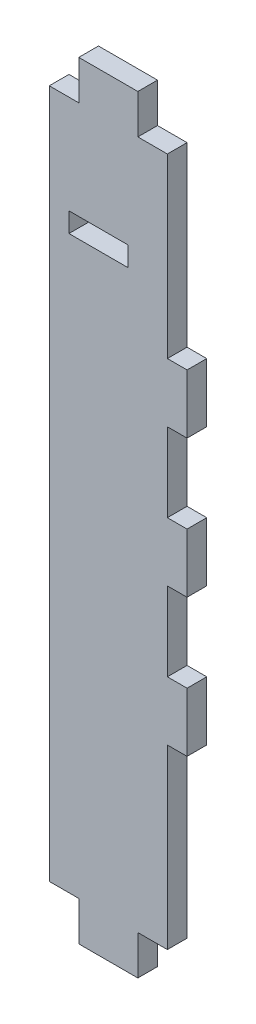
ISO-10303-21;
HEADER;
FILE_DESCRIPTION(('STEP AP214'),'2;1');
FILE_NAME('part.step','',(''),(''),'','','');
FILE_SCHEMA(('AUTOMOTIVE_DESIGN { 1 0 10303 214 1 1 1 1 }'));
ENDSEC;
DATA;
#1=APPLICATION_CONTEXT('core data for automotive mechanical design processes');
#2=APPLICATION_PROTOCOL_DEFINITION('international standard','automotive_design',2000,#1);
#3=PRODUCT_CONTEXT('',#1,'mechanical');
#4=PRODUCT('Part','Part','',(#3));
#5=PRODUCT_RELATED_PRODUCT_CATEGORY('part','',(#4));
#6=PRODUCT_DEFINITION_FORMATION('','',#4);
#7=PRODUCT_DEFINITION_CONTEXT('part definition',#1,'design');
#8=PRODUCT_DEFINITION('design','',#6,#7);
#9=PRODUCT_DEFINITION_SHAPE('','',#8);
#10=(LENGTH_UNIT() NAMED_UNIT(*) SI_UNIT(.MILLI.,.METRE.));
#11=(NAMED_UNIT(*) PLANE_ANGLE_UNIT() SI_UNIT($,.RADIAN.));
#12=(NAMED_UNIT(*) SI_UNIT($,.STERADIAN.) SOLID_ANGLE_UNIT());
#13=UNCERTAINTY_MEASURE_WITH_UNIT(LENGTH_MEASURE(1.E-05),#10,'distance_accuracy_value','');
#14=(GEOMETRIC_REPRESENTATION_CONTEXT(3) GLOBAL_UNCERTAINTY_ASSIGNED_CONTEXT((#13)) GLOBAL_UNIT_ASSIGNED_CONTEXT((#10,
#11,#12)) REPRESENTATION_CONTEXT('',''));
#15=CARTESIAN_POINT('',(0.,0.,0.));
#16=DIRECTION('',(0.,0.,1.));
#17=DIRECTION('',(1.,0.,0.));
#18=AXIS2_PLACEMENT_3D('',#15,#16,#17);
#19=CARTESIAN_POINT('',(405.,0.,-2.5));
#20=DIRECTION('',(-1.,0.,0.));
#21=DIRECTION('',(0.,0.,1.));
#22=AXIS2_PLACEMENT_3D('',#19,#20,#21);
#23=PLANE('',#22);
#24=DIRECTION('',(0.,-1.,0.));
#25=VECTOR('',#24,1.);
#26=CARTESIAN_POINT('',(405.,0.,2.5));
#27=LINE('',#26,#25);
#28=CARTESIAN_POINT('',(405.,405.000000000109,2.5));
#29=VERTEX_POINT('',#28);
#30=CARTESIAN_POINT('',(405.,400.000000000109,2.5));
#31=VERTEX_POINT('',#30);
#32=EDGE_CURVE('E316',#29,#31,#27,.T.);
#33=ORIENTED_EDGE('',*,*,#32,.T.);
#34=DIRECTION('',(0.,0.,1.));
#35=VECTOR('',#34,1.);
#36=CARTESIAN_POINT('',(405.,400.000000000109,-2.5));
#37=LINE('',#36,#35);
#38=CARTESIAN_POINT('',(405.,400.000000000109,-2.5));
#39=VERTEX_POINT('',#38);
#40=EDGE_CURVE('E11',#39,#31,#37,.T.);
#41=ORIENTED_EDGE('',*,*,#40,.F.);
#42=DIRECTION('',(0.,-1.,0.));
#43=VECTOR('',#42,1.);
#44=CARTESIAN_POINT('',(405.,0.,-2.5));
#45=LINE('',#44,#43);
#46=CARTESIAN_POINT('',(405.,405.000000000109,-2.5));
#47=VERTEX_POINT('',#46);
#48=EDGE_CURVE('E58',#47,#39,#45,.T.);
#49=ORIENTED_EDGE('',*,*,#48,.F.);
#50=DIRECTION('',(0.,0.,1.));
#51=VECTOR('',#50,1.);
#52=CARTESIAN_POINT('',(405.,405.000000000109,-2.5));
#53=LINE('',#52,#51);
#54=EDGE_CURVE('E239',#47,#29,#53,.T.);
#55=ORIENTED_EDGE('',*,*,#54,.T.);
#56=EDGE_LOOP('',(#33,#41,#49,#55));
#57=FACE_BOUND('',#56,.T.);
#58=ADVANCED_FACE('F39',(#57),#23,.F.);
#59=CARTESIAN_POINT('',(0.,400.000000000109,-2.5));
#60=DIRECTION('',(0.,1.,0.));
#61=DIRECTION('',(0.,0.,1.));
#62=AXIS2_PLACEMENT_3D('',#59,#60,#61);
#63=PLANE('',#62);
#64=DIRECTION('',(-1.,0.,0.));
#65=VECTOR('',#64,1.);
#66=CARTESIAN_POINT('',(0.,400.000000000109,2.5));
#67=LINE('',#66,#65);
#68=CARTESIAN_POINT('',(420.,400.000000000109,2.5));
#69=VERTEX_POINT('',#68);
#70=EDGE_CURVE('E321',#69,#31,#67,.T.);
#71=ORIENTED_EDGE('',*,*,#70,.F.);
#72=DIRECTION('',(0.,0.,1.));
#73=VECTOR('',#72,1.);
#74=CARTESIAN_POINT('',(420.,400.000000000109,-2.5));
#75=LINE('',#74,#73);
#76=CARTESIAN_POINT('',(420.,400.000000000109,-2.5));
#77=VERTEX_POINT('',#76);
#78=EDGE_CURVE('E49',#77,#69,#75,.T.);
#79=ORIENTED_EDGE('',*,*,#78,.F.);
#80=DIRECTION('',(-1.,0.,0.));
#81=VECTOR('',#80,1.);
#82=CARTESIAN_POINT('',(0.,400.000000000109,-2.5));
#83=LINE('',#82,#81);
#84=EDGE_CURVE('E247',#77,#39,#83,.T.);
#85=ORIENTED_EDGE('',*,*,#84,.T.);
#86=ORIENTED_EDGE('',*,*,#40,.T.);
#87=EDGE_LOOP('',(#71,#79,#85,#86));
#88=FACE_BOUND('',#87,.T.);
#89=ADVANCED_FACE('F403',(#88),#63,.T.);
#90=CARTESIAN_POINT('',(419.999999999996,-4.66293670342561E-12,-2.5));
#91=DIRECTION('',(-1.,0.,0.));
#92=DIRECTION('',(0.,-1.,0.));
#93=AXIS2_PLACEMENT_3D('',#90,#91,#92);
#94=PLANE('',#93);
#95=DIRECTION('',(0.,-1.,0.));
#96=VECTOR('',#95,1.);
#97=CARTESIAN_POINT('',(419.999999999996,-4.66293670342561E-12,2.5));
#98=LINE('',#97,#96);
#99=CARTESIAN_POINT('',(420.,405.000000000109,2.5));
#100=VERTEX_POINT('',#99);
#101=EDGE_CURVE('E236',#100,#69,#98,.T.);
#102=ORIENTED_EDGE('',*,*,#101,.F.);
#103=DIRECTION('',(0.,0.,1.));
#104=VECTOR('',#103,1.);
#105=CARTESIAN_POINT('',(420.,405.000000000109,-2.5));
#106=LINE('',#105,#104);
#107=CARTESIAN_POINT('',(420.,405.000000000109,-2.5));
#108=VERTEX_POINT('',#107);
#109=EDGE_CURVE('E231',#108,#100,#106,.T.);
#110=ORIENTED_EDGE('',*,*,#109,.F.);
#111=DIRECTION('',(0.,-1.,0.));
#112=VECTOR('',#111,1.);
#113=CARTESIAN_POINT('',(419.999999999996,-4.66293670342561E-12,-2.5));
#114=LINE('',#113,#112);
#115=EDGE_CURVE('E235',#108,#77,#114,.T.);
#116=ORIENTED_EDGE('',*,*,#115,.T.);
#117=ORIENTED_EDGE('',*,*,#78,.T.);
#118=EDGE_LOOP('',(#102,#110,#116,#117));
#119=FACE_BOUND('',#118,.T.);
#120=ADVANCED_FACE('F233',(#119),#94,.T.);
#121=CARTESIAN_POINT('',(430.,0.,-2.5));
#122=DIRECTION('',(-1.,0.,0.));
#123=DIRECTION('',(0.,0.,1.));
#124=AXIS2_PLACEMENT_3D('',#121,#122,#123);
#125=PLANE('',#124);
#126=DIRECTION('',(0.,-1.,0.));
#127=VECTOR('',#126,1.);
#128=CARTESIAN_POINT('',(430.,0.,2.5));
#129=LINE('',#128,#127);
#130=CARTESIAN_POINT('',(430.,300.00000000011,2.5));
#131=VERTEX_POINT('',#130);
#132=CARTESIAN_POINT('',(430.,255.000000000111,2.5));
#133=VERTEX_POINT('',#132);
#134=EDGE_CURVE('E252',#131,#133,#129,.T.);
#135=ORIENTED_EDGE('',*,*,#134,.T.);
#136=DIRECTION('',(0.,0.,1.));
#137=VECTOR('',#136,1.);
#138=CARTESIAN_POINT('',(430.,255.000000000111,-2.5));
#139=LINE('',#138,#137);
#140=CARTESIAN_POINT('',(430.,255.000000000111,-2.5));
#141=VERTEX_POINT('',#140);
#142=EDGE_CURVE('E327',#141,#133,#139,.T.);
#143=ORIENTED_EDGE('',*,*,#142,.F.);
#144=DIRECTION('',(0.,-1.,0.));
#145=VECTOR('',#144,1.);
#146=CARTESIAN_POINT('',(430.,0.,-2.5));
#147=LINE('',#146,#145);
#148=CARTESIAN_POINT('',(430.,300.00000000011,-2.5));
#149=VERTEX_POINT('',#148);
#150=EDGE_CURVE('E323',#149,#141,#147,.T.);
#151=ORIENTED_EDGE('',*,*,#150,.F.);
#152=DIRECTION('',(0.,0.,1.));
#153=VECTOR('',#152,1.);
#154=CARTESIAN_POINT('',(430.,300.00000000011,-2.5));
#155=LINE('',#154,#153);
#156=EDGE_CURVE('E43',#149,#131,#155,.T.);
#157=ORIENTED_EDGE('',*,*,#156,.T.);
#158=EDGE_LOOP('',(#135,#143,#151,#157));
#159=FACE_BOUND('',#158,.T.);
#160=ADVANCED_FACE('F41',(#159),#125,.F.);
#161=CARTESIAN_POINT('',(0.,255.000000000111,-2.5));
#162=DIRECTION('',(0.,1.,0.));
#163=DIRECTION('',(0.,0.,1.));
#164=AXIS2_PLACEMENT_3D('',#161,#162,#163);
#165=PLANE('',#164);
#166=DIRECTION('',(-1.,0.,0.));
#167=VECTOR('',#166,1.);
#168=CARTESIAN_POINT('',(0.,255.000000000111,2.5));
#169=LINE('',#168,#167);
#170=CARTESIAN_POINT('',(422.5,255.000000000111,2.5));
#171=VERTEX_POINT('',#170);
#172=EDGE_CURVE('E314',#133,#171,#169,.T.);
#173=ORIENTED_EDGE('',*,*,#172,.T.);
#174=DIRECTION('',(0.,0.,1.));
#175=VECTOR('',#174,1.);
#176=CARTESIAN_POINT('',(422.5,255.000000000111,-2.5));
#177=LINE('',#176,#175);
#178=CARTESIAN_POINT('',(422.5,255.000000000111,-2.5));
#179=VERTEX_POINT('',#178);
#180=EDGE_CURVE('E330',#179,#171,#177,.T.);
#181=ORIENTED_EDGE('',*,*,#180,.F.);
#182=DIRECTION('',(-1.,0.,0.));
#183=VECTOR('',#182,1.);
#184=CARTESIAN_POINT('',(0.,255.000000000111,-2.5));
#185=LINE('',#184,#183);
#186=EDGE_CURVE('E557',#141,#179,#185,.T.);
#187=ORIENTED_EDGE('',*,*,#186,.F.);
#188=ORIENTED_EDGE('',*,*,#142,.T.);
#189=EDGE_LOOP('',(#173,#181,#187,#188));
#190=FACE_BOUND('',#189,.T.);
#191=ADVANCED_FACE('F412',(#190),#165,.F.);
#192=CARTESIAN_POINT('',(422.5,0.,-2.5));
#193=DIRECTION('',(-1.,0.,0.));
#194=DIRECTION('',(0.,0.,1.));
#195=AXIS2_PLACEMENT_3D('',#192,#193,#194);
#196=PLANE('',#195);
#197=DIRECTION('',(0.,-1.,0.));
#198=VECTOR('',#197,1.);
#199=CARTESIAN_POINT('',(422.5,0.,2.5));
#200=LINE('',#199,#198);
#201=CARTESIAN_POINT('',(422.5,245.000000000111,2.5));
#202=VERTEX_POINT('',#201);
#203=EDGE_CURVE('E312',#171,#202,#200,.T.);
#204=ORIENTED_EDGE('',*,*,#203,.T.);
#205=DIRECTION('',(0.,0.,1.));
#206=VECTOR('',#205,1.);
#207=CARTESIAN_POINT('',(422.5,245.000000000111,-2.5));
#208=LINE('',#207,#206);
#209=CARTESIAN_POINT('',(422.5,245.000000000111,-2.5));
#210=VERTEX_POINT('',#209);
#211=EDGE_CURVE('E333',#210,#202,#208,.T.);
#212=ORIENTED_EDGE('',*,*,#211,.F.);
#213=DIRECTION('',(0.,-1.,0.));
#214=VECTOR('',#213,1.);
#215=CARTESIAN_POINT('',(422.5,0.,-2.5));
#216=LINE('',#215,#214);
#217=EDGE_CURVE('E555',#179,#210,#216,.T.);
#218=ORIENTED_EDGE('',*,*,#217,.F.);
#219=ORIENTED_EDGE('',*,*,#180,.T.);
#220=EDGE_LOOP('',(#204,#212,#218,#219));
#221=FACE_BOUND('',#220,.T.);
#222=ADVANCED_FACE('F415',(#221),#196,.F.);
#223=CARTESIAN_POINT('',(0.,245.000000000111,-2.5));
#224=DIRECTION('',(0.,1.,0.));
#225=DIRECTION('',(0.,0.,1.));
#226=AXIS2_PLACEMENT_3D('',#223,#224,#225);
#227=PLANE('',#226);
#228=DIRECTION('',(-1.,0.,0.));
#229=VECTOR('',#228,1.);
#230=CARTESIAN_POINT('',(0.,245.000000000111,2.5));
#231=LINE('',#230,#229);
#232=CARTESIAN_POINT('',(407.5,245.000000000111,2.5));
#233=VERTEX_POINT('',#232);
#234=EDGE_CURVE('E309',#202,#233,#231,.T.);
#235=ORIENTED_EDGE('',*,*,#234,.T.);
#236=DIRECTION('',(0.,0.,1.));
#237=VECTOR('',#236,1.);
#238=CARTESIAN_POINT('',(407.5,245.000000000111,-2.5));
#239=LINE('',#238,#237);
#240=CARTESIAN_POINT('',(407.5,245.000000000111,-2.5));
#241=VERTEX_POINT('',#240);
#242=EDGE_CURVE('E336',#241,#233,#239,.T.);
#243=ORIENTED_EDGE('',*,*,#242,.F.);
#244=DIRECTION('',(-1.,0.,0.));
#245=VECTOR('',#244,1.);
#246=CARTESIAN_POINT('',(0.,245.000000000111,-2.5));
#247=LINE('',#246,#245);
#248=EDGE_CURVE('E553',#210,#241,#247,.T.);
#249=ORIENTED_EDGE('',*,*,#248,.F.);
#250=ORIENTED_EDGE('',*,*,#211,.T.);
#251=EDGE_LOOP('',(#235,#243,#249,#250));
#252=FACE_BOUND('',#251,.T.);
#253=ADVANCED_FACE('F419',(#252),#227,.F.);
#254=CARTESIAN_POINT('',(407.5,0.,-2.5));
#255=DIRECTION('',(-1.,0.,0.));
#256=DIRECTION('',(0.,0.,1.));
#257=AXIS2_PLACEMENT_3D('',#254,#255,#256);
#258=PLANE('',#257);
#259=DIRECTION('',(0.,-1.,0.));
#260=VECTOR('',#259,1.);
#261=CARTESIAN_POINT('',(407.5,0.,2.5));
#262=LINE('',#261,#260);
#263=CARTESIAN_POINT('',(407.5,255.000000000111,2.5));
#264=VERTEX_POINT('',#263);
#265=EDGE_CURVE('E306',#264,#233,#262,.T.);
#266=ORIENTED_EDGE('',*,*,#265,.F.);
#267=DIRECTION('',(0.,0.,1.));
#268=VECTOR('',#267,1.);
#269=CARTESIAN_POINT('',(407.5,255.000000000111,-2.5));
#270=LINE('',#269,#268);
#271=CARTESIAN_POINT('',(407.5,255.000000000111,-2.5));
#272=VERTEX_POINT('',#271);
#273=EDGE_CURVE('E338',#272,#264,#270,.T.);
#274=ORIENTED_EDGE('',*,*,#273,.F.);
#275=DIRECTION('',(0.,-1.,0.));
#276=VECTOR('',#275,1.);
#277=CARTESIAN_POINT('',(407.5,0.,-2.5));
#278=LINE('',#277,#276);
#279=EDGE_CURVE('E550',#272,#241,#278,.T.);
#280=ORIENTED_EDGE('',*,*,#279,.T.);
#281=ORIENTED_EDGE('',*,*,#242,.T.);
#282=EDGE_LOOP('',(#266,#274,#280,#281));
#283=FACE_BOUND('',#282,.T.);
#284=ADVANCED_FACE('F423',(#283),#258,.T.);
#285=CARTESIAN_POINT('',(0.,255.000000000111,-2.5));
#286=DIRECTION('',(0.,1.,0.));
#287=DIRECTION('',(0.,0.,1.));
#288=AXIS2_PLACEMENT_3D('',#285,#286,#287);
#289=PLANE('',#288);
#290=DIRECTION('',(-1.,0.,0.));
#291=VECTOR('',#290,1.);
#292=CARTESIAN_POINT('',(0.,255.000000000111,2.5));
#293=LINE('',#292,#291);
#294=CARTESIAN_POINT('',(400.,255.000000000111,2.5));
#295=VERTEX_POINT('',#294);
#296=EDGE_CURVE('E303',#264,#295,#293,.T.);
#297=ORIENTED_EDGE('',*,*,#296,.T.);
#298=DIRECTION('',(0.,0.,1.));
#299=VECTOR('',#298,1.);
#300=CARTESIAN_POINT('',(400.,255.000000000111,-2.5));
#301=LINE('',#300,#299);
#302=CARTESIAN_POINT('',(400.,255.000000000111,-2.5));
#303=VERTEX_POINT('',#302);
#304=EDGE_CURVE('E340',#303,#295,#301,.T.);
#305=ORIENTED_EDGE('',*,*,#304,.F.);
#306=DIRECTION('',(-1.,0.,0.));
#307=VECTOR('',#306,1.);
#308=CARTESIAN_POINT('',(0.,255.000000000111,-2.5));
#309=LINE('',#308,#307);
#310=EDGE_CURVE('E548',#272,#303,#309,.T.);
#311=ORIENTED_EDGE('',*,*,#310,.F.);
#312=ORIENTED_EDGE('',*,*,#273,.T.);
#313=EDGE_LOOP('',(#297,#305,#311,#312));
#314=FACE_BOUND('',#313,.T.);
#315=ADVANCED_FACE('F427',(#314),#289,.F.);
#316=CARTESIAN_POINT('',(400.,0.,-2.5));
#317=DIRECTION('',(-1.,0.,0.));
#318=DIRECTION('',(0.,0.,1.));
#319=AXIS2_PLACEMENT_3D('',#316,#317,#318);
#320=PLANE('',#319);
#321=DIRECTION('',(0.,-1.,0.));
#322=VECTOR('',#321,1.);
#323=CARTESIAN_POINT('',(400.,0.,2.5));
#324=LINE('',#323,#322);
#325=CARTESIAN_POINT('',(400.,430.000000000109,2.5));
#326=VERTEX_POINT('',#325);
#327=EDGE_CURVE('E300',#326,#295,#324,.T.);
#328=ORIENTED_EDGE('',*,*,#327,.F.);
#329=DIRECTION('',(0.,0.,1.));
#330=VECTOR('',#329,1.);
#331=CARTESIAN_POINT('',(400.,430.000000000109,-2.5));
#332=LINE('',#331,#330);
#333=CARTESIAN_POINT('',(400.,430.000000000109,-2.5));
#334=VERTEX_POINT('',#333);
#335=EDGE_CURVE('E342',#334,#326,#332,.T.);
#336=ORIENTED_EDGE('',*,*,#335,.F.);
#337=DIRECTION('',(0.,-1.,0.));
#338=VECTOR('',#337,1.);
#339=CARTESIAN_POINT('',(400.,0.,-2.5));
#340=LINE('',#339,#338);
#341=EDGE_CURVE('E545',#334,#303,#340,.T.);
#342=ORIENTED_EDGE('',*,*,#341,.T.);
#343=ORIENTED_EDGE('',*,*,#304,.T.);
#344=EDGE_LOOP('',(#328,#336,#342,#343));
#345=FACE_BOUND('',#344,.T.);
#346=ADVANCED_FACE('F431',(#345),#320,.T.);
#347=CARTESIAN_POINT('',(0.,430.000000000109,-2.5));
#348=DIRECTION('',(0.,1.,0.));
#349=DIRECTION('',(0.,0.,1.));
#350=AXIS2_PLACEMENT_3D('',#347,#348,#349);
#351=PLANE('',#350);
#352=DIRECTION('',(-1.,0.,0.));
#353=VECTOR('',#352,1.);
#354=CARTESIAN_POINT('',(0.,430.000000000109,2.5));
#355=LINE('',#354,#353);
#356=CARTESIAN_POINT('',(407.5,430.000000000109,2.5));
#357=VERTEX_POINT('',#356);
#358=EDGE_CURVE('E297',#357,#326,#355,.T.);
#359=ORIENTED_EDGE('',*,*,#358,.F.);
#360=DIRECTION('',(0.,0.,1.));
#361=VECTOR('',#360,1.);
#362=CARTESIAN_POINT('',(407.5,430.000000000109,-2.5));
#363=LINE('',#362,#361);
#364=CARTESIAN_POINT('',(407.5,430.000000000109,-2.5));
#365=VERTEX_POINT('',#364);
#366=EDGE_CURVE('E344',#365,#357,#363,.T.);
#367=ORIENTED_EDGE('',*,*,#366,.F.);
#368=DIRECTION('',(-1.,0.,0.));
#369=VECTOR('',#368,1.);
#370=CARTESIAN_POINT('',(0.,430.000000000109,-2.5));
#371=LINE('',#370,#369);
#372=EDGE_CURVE('E542',#365,#334,#371,.T.);
#373=ORIENTED_EDGE('',*,*,#372,.T.);
#374=ORIENTED_EDGE('',*,*,#335,.T.);
#375=EDGE_LOOP('',(#359,#367,#373,#374));
#376=FACE_BOUND('',#375,.T.);
#377=ADVANCED_FACE('F435',(#376),#351,.T.);
#378=CARTESIAN_POINT('',(407.5,0.,-2.5));
#379=DIRECTION('',(1.,0.,0.));
#380=DIRECTION('',(0.,0.,-1.));
#381=AXIS2_PLACEMENT_3D('',#378,#379,#380);
#382=PLANE('',#381);
#383=DIRECTION('',(0.,1.,0.));
#384=VECTOR('',#383,1.);
#385=CARTESIAN_POINT('',(407.5,0.,2.5));
#386=LINE('',#385,#384);
#387=CARTESIAN_POINT('',(407.5,440.000000000109,2.5));
#388=VERTEX_POINT('',#387);
#389=EDGE_CURVE('E294',#357,#388,#386,.T.);
#390=ORIENTED_EDGE('',*,*,#389,.T.);
#391=DIRECTION('',(0.,0.,1.));
#392=VECTOR('',#391,1.);
#393=CARTESIAN_POINT('',(407.5,440.000000000109,-2.5));
#394=LINE('',#393,#392);
#395=CARTESIAN_POINT('',(407.5,440.000000000109,-2.5));
#396=VERTEX_POINT('',#395);
#397=EDGE_CURVE('E346',#396,#388,#394,.T.);
#398=ORIENTED_EDGE('',*,*,#397,.F.);
#399=DIRECTION('',(0.,1.,0.));
#400=VECTOR('',#399,1.);
#401=CARTESIAN_POINT('',(407.5,0.,-2.5));
#402=LINE('',#401,#400);
#403=EDGE_CURVE('E540',#365,#396,#402,.T.);
#404=ORIENTED_EDGE('',*,*,#403,.F.);
#405=ORIENTED_EDGE('',*,*,#366,.T.);
#406=EDGE_LOOP('',(#390,#398,#404,#405));
#407=FACE_BOUND('',#406,.T.);
#408=ADVANCED_FACE('F439',(#407),#382,.F.);
#409=CARTESIAN_POINT('',(0.,440.000000000109,-2.5));
#410=DIRECTION('',(0.,1.,0.));
#411=DIRECTION('',(0.,0.,1.));
#412=AXIS2_PLACEMENT_3D('',#409,#410,#411);
#413=PLANE('',#412);
#414=DIRECTION('',(-1.,0.,0.));
#415=VECTOR('',#414,1.);
#416=CARTESIAN_POINT('',(0.,440.000000000109,2.5));
#417=LINE('',#416,#415);
#418=CARTESIAN_POINT('',(422.5,440.000000000109,2.5));
#419=VERTEX_POINT('',#418);
#420=EDGE_CURVE('E291',#419,#388,#417,.T.);
#421=ORIENTED_EDGE('',*,*,#420,.F.);
#422=DIRECTION('',(0.,0.,1.));
#423=VECTOR('',#422,1.);
#424=CARTESIAN_POINT('',(422.5,440.000000000109,-2.5));
#425=LINE('',#424,#423);
#426=CARTESIAN_POINT('',(422.5,440.000000000109,-2.5));
#427=VERTEX_POINT('',#426);
#428=EDGE_CURVE('E348',#427,#419,#425,.T.);
#429=ORIENTED_EDGE('',*,*,#428,.F.);
#430=DIRECTION('',(-1.,0.,0.));
#431=VECTOR('',#430,1.);
#432=CARTESIAN_POINT('',(0.,440.000000000109,-2.5));
#433=LINE('',#432,#431);
#434=EDGE_CURVE('E537',#427,#396,#433,.T.);
#435=ORIENTED_EDGE('',*,*,#434,.T.);
#436=ORIENTED_EDGE('',*,*,#397,.T.);
#437=EDGE_LOOP('',(#421,#429,#435,#436));
#438=FACE_BOUND('',#437,.T.);
#439=ADVANCED_FACE('F443',(#438),#413,.T.);
#440=CARTESIAN_POINT('',(422.5,0.,-2.5));
#441=DIRECTION('',(1.,0.,0.));
#442=DIRECTION('',(0.,0.,-1.));
#443=AXIS2_PLACEMENT_3D('',#440,#441,#442);
#444=PLANE('',#443);
#445=DIRECTION('',(0.,1.,0.));
#446=VECTOR('',#445,1.);
#447=CARTESIAN_POINT('',(422.5,0.,2.5));
#448=LINE('',#447,#446);
#449=CARTESIAN_POINT('',(422.5,430.000000000109,2.5));
#450=VERTEX_POINT('',#449);
#451=EDGE_CURVE('E288',#450,#419,#448,.T.);
#452=ORIENTED_EDGE('',*,*,#451,.F.);
#453=DIRECTION('',(0.,0.,1.));
#454=VECTOR('',#453,1.);
#455=CARTESIAN_POINT('',(422.5,430.000000000109,-2.5));
#456=LINE('',#455,#454);
#457=CARTESIAN_POINT('',(422.5,430.000000000109,-2.5));
#458=VERTEX_POINT('',#457);
#459=EDGE_CURVE('E350',#458,#450,#456,.T.);
#460=ORIENTED_EDGE('',*,*,#459,.F.);
#461=DIRECTION('',(0.,1.,0.));
#462=VECTOR('',#461,1.);
#463=CARTESIAN_POINT('',(422.5,0.,-2.5));
#464=LINE('',#463,#462);
#465=EDGE_CURVE('E534',#458,#427,#464,.T.);
#466=ORIENTED_EDGE('',*,*,#465,.T.);
#467=ORIENTED_EDGE('',*,*,#428,.T.);
#468=EDGE_LOOP('',(#452,#460,#466,#467));
#469=FACE_BOUND('',#468,.T.);
#470=ADVANCED_FACE('F447',(#469),#444,.T.);
#471=CARTESIAN_POINT('',(0.,430.000000000109,-2.5));
#472=DIRECTION('',(0.,1.,0.));
#473=DIRECTION('',(0.,0.,1.));
#474=AXIS2_PLACEMENT_3D('',#471,#472,#473);
#475=PLANE('',#474);
#476=DIRECTION('',(-1.,0.,0.));
#477=VECTOR('',#476,1.);
#478=CARTESIAN_POINT('',(0.,430.000000000109,2.5));
#479=LINE('',#478,#477);
#480=CARTESIAN_POINT('',(430.,430.000000000109,2.5));
#481=VERTEX_POINT('',#480);
#482=EDGE_CURVE('E285',#481,#450,#479,.T.);
#483=ORIENTED_EDGE('',*,*,#482,.F.);
#484=DIRECTION('',(0.,0.,1.));
#485=VECTOR('',#484,1.);
#486=CARTESIAN_POINT('',(430.,430.000000000109,-2.5));
#487=LINE('',#486,#485);
#488=CARTESIAN_POINT('',(430.,430.000000000109,-2.5));
#489=VERTEX_POINT('',#488);
#490=EDGE_CURVE('E352',#489,#481,#487,.T.);
#491=ORIENTED_EDGE('',*,*,#490,.F.);
#492=DIRECTION('',(-1.,0.,0.));
#493=VECTOR('',#492,1.);
#494=CARTESIAN_POINT('',(0.,430.000000000109,-2.5));
#495=LINE('',#494,#493);
#496=EDGE_CURVE('E531',#489,#458,#495,.T.);
#497=ORIENTED_EDGE('',*,*,#496,.T.);
#498=ORIENTED_EDGE('',*,*,#459,.T.);
#499=EDGE_LOOP('',(#483,#491,#497,#498));
#500=FACE_BOUND('',#499,.T.);
#501=ADVANCED_FACE('F451',(#500),#475,.T.);
#502=CARTESIAN_POINT('',(430.,0.,-2.5));
#503=DIRECTION('',(-1.,0.,0.));
#504=DIRECTION('',(0.,0.,1.));
#505=AXIS2_PLACEMENT_3D('',#502,#503,#504);
#506=PLANE('',#505);
#507=DIRECTION('',(0.,-1.,0.));
#508=VECTOR('',#507,1.);
#509=CARTESIAN_POINT('',(430.,0.,2.5));
#510=LINE('',#509,#508);
#511=CARTESIAN_POINT('',(430.,385.00000000011,2.5));
#512=VERTEX_POINT('',#511);
#513=EDGE_CURVE('E283',#481,#512,#510,.T.);
#514=ORIENTED_EDGE('',*,*,#513,.T.);
#515=DIRECTION('',(0.,0.,1.));
#516=VECTOR('',#515,1.);
#517=CARTESIAN_POINT('',(430.,385.00000000011,-2.5));
#518=LINE('',#517,#516);
#519=CARTESIAN_POINT('',(430.,385.00000000011,-2.5));
#520=VERTEX_POINT('',#519);
#521=EDGE_CURVE('E354',#520,#512,#518,.T.);
#522=ORIENTED_EDGE('',*,*,#521,.F.);
#523=DIRECTION('',(0.,-1.,0.));
#524=VECTOR('',#523,1.);
#525=CARTESIAN_POINT('',(430.,0.,-2.5));
#526=LINE('',#525,#524);
#527=EDGE_CURVE('E529',#489,#520,#526,.T.);
#528=ORIENTED_EDGE('',*,*,#527,.F.);
#529=ORIENTED_EDGE('',*,*,#490,.T.);
#530=EDGE_LOOP('',(#514,#522,#528,#529));
#531=FACE_BOUND('',#530,.T.);
#532=ADVANCED_FACE('F455',(#531),#506,.F.);
#533=CARTESIAN_POINT('',(0.,385.00000000011,-2.5));
#534=DIRECTION('',(0.,-1.,0.));
#535=DIRECTION('',(0.,0.,-1.));
#536=AXIS2_PLACEMENT_3D('',#533,#534,#535);
#537=PLANE('',#536);
#538=DIRECTION('',(1.,0.,0.));
#539=VECTOR('',#538,1.);
#540=CARTESIAN_POINT('',(0.,385.00000000011,2.5));
#541=LINE('',#540,#539);
#542=CARTESIAN_POINT('',(435.,385.00000000011,2.5));
#543=VERTEX_POINT('',#542);
#544=EDGE_CURVE('E281',#512,#543,#541,.T.);
#545=ORIENTED_EDGE('',*,*,#544,.T.);
#546=DIRECTION('',(0.,0.,1.));
#547=VECTOR('',#546,1.);
#548=CARTESIAN_POINT('',(435.,385.00000000011,-2.5));
#549=LINE('',#548,#547);
#550=CARTESIAN_POINT('',(435.,385.00000000011,-2.5));
#551=VERTEX_POINT('',#550);
#552=EDGE_CURVE('E357',#551,#543,#549,.T.);
#553=ORIENTED_EDGE('',*,*,#552,.F.);
#554=DIRECTION('',(1.,0.,0.));
#555=VECTOR('',#554,1.);
#556=CARTESIAN_POINT('',(0.,385.00000000011,-2.5));
#557=LINE('',#556,#555);
#558=EDGE_CURVE('E527',#520,#551,#557,.T.);
#559=ORIENTED_EDGE('',*,*,#558,.F.);
#560=ORIENTED_EDGE('',*,*,#521,.T.);
#561=EDGE_LOOP('',(#545,#553,#559,#560));
#562=FACE_BOUND('',#561,.T.);
#563=ADVANCED_FACE('F459',(#562),#537,.F.);
#564=CARTESIAN_POINT('',(435.,0.,-2.5));
#565=DIRECTION('',(-1.,0.,0.));
#566=DIRECTION('',(0.,0.,1.));
#567=AXIS2_PLACEMENT_3D('',#564,#565,#566);
#568=PLANE('',#567);
#569=DIRECTION('',(0.,-1.,0.));
#570=VECTOR('',#569,1.);
#571=CARTESIAN_POINT('',(435.,0.,2.5));
#572=LINE('',#571,#570);
#573=CARTESIAN_POINT('',(435.,370.00000000011,2.5));
#574=VERTEX_POINT('',#573);
#575=EDGE_CURVE('E278',#543,#574,#572,.T.);
#576=ORIENTED_EDGE('',*,*,#575,.T.);
#577=DIRECTION('',(0.,0.,1.));
#578=VECTOR('',#577,1.);
#579=CARTESIAN_POINT('',(435.,370.00000000011,-2.5));
#580=LINE('',#579,#578);
#581=CARTESIAN_POINT('',(435.,370.00000000011,-2.5));
#582=VERTEX_POINT('',#581);
#583=EDGE_CURVE('E360',#582,#574,#580,.T.);
#584=ORIENTED_EDGE('',*,*,#583,.F.);
#585=DIRECTION('',(0.,-1.,0.));
#586=VECTOR('',#585,1.);
#587=CARTESIAN_POINT('',(435.,0.,-2.5));
#588=LINE('',#587,#586);
#589=EDGE_CURVE('E525',#551,#582,#588,.T.);
#590=ORIENTED_EDGE('',*,*,#589,.F.);
#591=ORIENTED_EDGE('',*,*,#552,.T.);
#592=EDGE_LOOP('',(#576,#584,#590,#591));
#593=FACE_BOUND('',#592,.T.);
#594=ADVANCED_FACE('F463',(#593),#568,.F.);
#595=CARTESIAN_POINT('',(0.,370.00000000011,-2.5));
#596=DIRECTION('',(0.,-1.,0.));
#597=DIRECTION('',(0.,0.,-1.));
#598=AXIS2_PLACEMENT_3D('',#595,#596,#597);
#599=PLANE('',#598);
#600=DIRECTION('',(1.,0.,0.));
#601=VECTOR('',#600,1.);
#602=CARTESIAN_POINT('',(0.,370.00000000011,2.5));
#603=LINE('',#602,#601);
#604=CARTESIAN_POINT('',(430.,370.00000000011,2.5));
#605=VERTEX_POINT('',#604);
#606=EDGE_CURVE('E275',#605,#574,#603,.T.);
#607=ORIENTED_EDGE('',*,*,#606,.F.);
#608=DIRECTION('',(0.,0.,1.));
#609=VECTOR('',#608,1.);
#610=CARTESIAN_POINT('',(430.,370.00000000011,-2.5));
#611=LINE('',#610,#609);
#612=CARTESIAN_POINT('',(430.,370.00000000011,-2.5));
#613=VERTEX_POINT('',#612);
#614=EDGE_CURVE('E362',#613,#605,#611,.T.);
#615=ORIENTED_EDGE('',*,*,#614,.F.);
#616=DIRECTION('',(1.,0.,0.));
#617=VECTOR('',#616,1.);
#618=CARTESIAN_POINT('',(0.,370.00000000011,-2.5));
#619=LINE('',#618,#617);
#620=EDGE_CURVE('E522',#613,#582,#619,.T.);
#621=ORIENTED_EDGE('',*,*,#620,.T.);
#622=ORIENTED_EDGE('',*,*,#583,.T.);
#623=EDGE_LOOP('',(#607,#615,#621,#622));
#624=FACE_BOUND('',#623,.T.);
#625=ADVANCED_FACE('F467',(#624),#599,.T.);
#626=CARTESIAN_POINT('',(430.,0.,-2.5));
#627=DIRECTION('',(-1.,0.,0.));
#628=DIRECTION('',(0.,0.,1.));
#629=AXIS2_PLACEMENT_3D('',#626,#627,#628);
#630=PLANE('',#629);
#631=DIRECTION('',(0.,-1.,0.));
#632=VECTOR('',#631,1.);
#633=CARTESIAN_POINT('',(430.,0.,2.5));
#634=LINE('',#633,#632);
#635=CARTESIAN_POINT('',(430.,350.00000000011,2.5));
#636=VERTEX_POINT('',#635);
#637=EDGE_CURVE('E273',#605,#636,#634,.T.);
#638=ORIENTED_EDGE('',*,*,#637,.T.);
#639=DIRECTION('',(0.,0.,1.));
#640=VECTOR('',#639,1.);
#641=CARTESIAN_POINT('',(430.,350.00000000011,-2.5));
#642=LINE('',#641,#640);
#643=CARTESIAN_POINT('',(430.,350.00000000011,-2.5));
#644=VERTEX_POINT('',#643);
#645=EDGE_CURVE('E364',#644,#636,#642,.T.);
#646=ORIENTED_EDGE('',*,*,#645,.F.);
#647=DIRECTION('',(0.,-1.,0.));
#648=VECTOR('',#647,1.);
#649=CARTESIAN_POINT('',(430.,0.,-2.5));
#650=LINE('',#649,#648);
#651=EDGE_CURVE('E520',#613,#644,#650,.T.);
#652=ORIENTED_EDGE('',*,*,#651,.F.);
#653=ORIENTED_EDGE('',*,*,#614,.T.);
#654=EDGE_LOOP('',(#638,#646,#652,#653));
#655=FACE_BOUND('',#654,.T.);
#656=ADVANCED_FACE('F471',(#655),#630,.F.);
#657=CARTESIAN_POINT('',(0.,350.00000000011,-2.5));
#658=DIRECTION('',(0.,-1.,0.));
#659=DIRECTION('',(0.,0.,-1.));
#660=AXIS2_PLACEMENT_3D('',#657,#658,#659);
#661=PLANE('',#660);
#662=DIRECTION('',(1.,0.,0.));
#663=VECTOR('',#662,1.);
#664=CARTESIAN_POINT('',(0.,350.00000000011,2.5));
#665=LINE('',#664,#663);
#666=CARTESIAN_POINT('',(435.,350.00000000011,2.5));
#667=VERTEX_POINT('',#666);
#668=EDGE_CURVE('E271',#636,#667,#665,.T.);
#669=ORIENTED_EDGE('',*,*,#668,.T.);
#670=DIRECTION('',(0.,0.,1.));
#671=VECTOR('',#670,1.);
#672=CARTESIAN_POINT('',(435.,350.00000000011,-2.5));
#673=LINE('',#672,#671);
#674=CARTESIAN_POINT('',(435.,350.00000000011,-2.5));
#675=VERTEX_POINT('',#674);
#676=EDGE_CURVE('E367',#675,#667,#673,.T.);
#677=ORIENTED_EDGE('',*,*,#676,.F.);
#678=DIRECTION('',(1.,0.,0.));
#679=VECTOR('',#678,1.);
#680=CARTESIAN_POINT('',(0.,350.00000000011,-2.5));
#681=LINE('',#680,#679);
#682=EDGE_CURVE('E518',#644,#675,#681,.T.);
#683=ORIENTED_EDGE('',*,*,#682,.F.);
#684=ORIENTED_EDGE('',*,*,#645,.T.);
#685=EDGE_LOOP('',(#669,#677,#683,#684));
#686=FACE_BOUND('',#685,.T.);
#687=ADVANCED_FACE('F475',(#686),#661,.F.);
#688=CARTESIAN_POINT('',(435.,0.,-2.5));
#689=DIRECTION('',(-1.,0.,0.));
#690=DIRECTION('',(0.,0.,1.));
#691=AXIS2_PLACEMENT_3D('',#688,#689,#690);
#692=PLANE('',#691);
#693=DIRECTION('',(0.,-1.,0.));
#694=VECTOR('',#693,1.);
#695=CARTESIAN_POINT('',(435.,0.,2.5));
#696=LINE('',#695,#694);
#697=CARTESIAN_POINT('',(435.,335.00000000011,2.5));
#698=VERTEX_POINT('',#697);
#699=EDGE_CURVE('E268',#667,#698,#696,.T.);
#700=ORIENTED_EDGE('',*,*,#699,.T.);
#701=DIRECTION('',(0.,0.,1.));
#702=VECTOR('',#701,1.);
#703=CARTESIAN_POINT('',(435.,335.00000000011,-2.5));
#704=LINE('',#703,#702);
#705=CARTESIAN_POINT('',(435.,335.00000000011,-2.5));
#706=VERTEX_POINT('',#705);
#707=EDGE_CURVE('E370',#706,#698,#704,.T.);
#708=ORIENTED_EDGE('',*,*,#707,.F.);
#709=DIRECTION('',(0.,-1.,0.));
#710=VECTOR('',#709,1.);
#711=CARTESIAN_POINT('',(435.,0.,-2.5));
#712=LINE('',#711,#710);
#713=EDGE_CURVE('E516',#675,#706,#712,.T.);
#714=ORIENTED_EDGE('',*,*,#713,.F.);
#715=ORIENTED_EDGE('',*,*,#676,.T.);
#716=EDGE_LOOP('',(#700,#708,#714,#715));
#717=FACE_BOUND('',#716,.T.);
#718=ADVANCED_FACE('F479',(#717),#692,.F.);
#719=CARTESIAN_POINT('',(0.,335.00000000011,-2.5));
#720=DIRECTION('',(0.,-1.,0.));
#721=DIRECTION('',(0.,0.,-1.));
#722=AXIS2_PLACEMENT_3D('',#719,#720,#721);
#723=PLANE('',#722);
#724=DIRECTION('',(1.,0.,0.));
#725=VECTOR('',#724,1.);
#726=CARTESIAN_POINT('',(0.,335.00000000011,2.5));
#727=LINE('',#726,#725);
#728=CARTESIAN_POINT('',(430.,335.00000000011,2.5));
#729=VERTEX_POINT('',#728);
#730=EDGE_CURVE('E265',#729,#698,#727,.T.);
#731=ORIENTED_EDGE('',*,*,#730,.F.);
#732=DIRECTION('',(0.,0.,1.));
#733=VECTOR('',#732,1.);
#734=CARTESIAN_POINT('',(430.,335.00000000011,-2.5));
#735=LINE('',#734,#733);
#736=CARTESIAN_POINT('',(430.,335.00000000011,-2.5));
#737=VERTEX_POINT('',#736);
#738=EDGE_CURVE('E372',#737,#729,#735,.T.);
#739=ORIENTED_EDGE('',*,*,#738,.F.);
#740=DIRECTION('',(1.,0.,0.));
#741=VECTOR('',#740,1.);
#742=CARTESIAN_POINT('',(0.,335.00000000011,-2.5));
#743=LINE('',#742,#741);
#744=EDGE_CURVE('E513',#737,#706,#743,.T.);
#745=ORIENTED_EDGE('',*,*,#744,.T.);
#746=ORIENTED_EDGE('',*,*,#707,.T.);
#747=EDGE_LOOP('',(#731,#739,#745,#746));
#748=FACE_BOUND('',#747,.T.);
#749=ADVANCED_FACE('F483',(#748),#723,.T.);
#750=CARTESIAN_POINT('',(430.,0.,-2.5));
#751=DIRECTION('',(-1.,0.,0.));
#752=DIRECTION('',(0.,0.,1.));
#753=AXIS2_PLACEMENT_3D('',#750,#751,#752);
#754=PLANE('',#753);
#755=DIRECTION('',(0.,-1.,0.));
#756=VECTOR('',#755,1.);
#757=CARTESIAN_POINT('',(430.,0.,2.5));
#758=LINE('',#757,#756);
#759=CARTESIAN_POINT('',(430.,315.00000000011,2.5));
#760=VERTEX_POINT('',#759);
#761=EDGE_CURVE('E263',#729,#760,#758,.T.);
#762=ORIENTED_EDGE('',*,*,#761,.T.);
#763=DIRECTION('',(0.,0.,1.));
#764=VECTOR('',#763,1.);
#765=CARTESIAN_POINT('',(430.,315.00000000011,-2.5));
#766=LINE('',#765,#764);
#767=CARTESIAN_POINT('',(430.,315.00000000011,-2.5));
#768=VERTEX_POINT('',#767);
#769=EDGE_CURVE('E374',#768,#760,#766,.T.);
#770=ORIENTED_EDGE('',*,*,#769,.F.);
#771=DIRECTION('',(0.,-1.,0.));
#772=VECTOR('',#771,1.);
#773=CARTESIAN_POINT('',(430.,0.,-2.5));
#774=LINE('',#773,#772);
#775=EDGE_CURVE('E507',#737,#768,#774,.T.);
#776=ORIENTED_EDGE('',*,*,#775,.F.);
#777=ORIENTED_EDGE('',*,*,#738,.T.);
#778=EDGE_LOOP('',(#762,#770,#776,#777));
#779=FACE_BOUND('',#778,.T.);
#780=ADVANCED_FACE('F487',(#779),#754,.F.);
#781=CARTESIAN_POINT('',(0.,315.00000000011,-2.5));
#782=DIRECTION('',(0.,-1.,0.));
#783=DIRECTION('',(0.,0.,-1.));
#784=AXIS2_PLACEMENT_3D('',#781,#782,#783);
#785=PLANE('',#784);
#786=DIRECTION('',(1.,0.,0.));
#787=VECTOR('',#786,1.);
#788=CARTESIAN_POINT('',(0.,315.00000000011,2.5));
#789=LINE('',#788,#787);
#790=CARTESIAN_POINT('',(435.,315.00000000011,2.5));
#791=VERTEX_POINT('',#790);
#792=EDGE_CURVE('E261',#760,#791,#789,.T.);
#793=ORIENTED_EDGE('',*,*,#792,.T.);
#794=DIRECTION('',(0.,0.,1.));
#795=VECTOR('',#794,1.);
#796=CARTESIAN_POINT('',(435.,315.00000000011,-2.5));
#797=LINE('',#796,#795);
#798=CARTESIAN_POINT('',(435.,315.00000000011,-2.5));
#799=VERTEX_POINT('',#798);
#800=EDGE_CURVE('E377',#799,#791,#797,.T.);
#801=ORIENTED_EDGE('',*,*,#800,.F.);
#802=DIRECTION('',(1.,0.,0.));
#803=VECTOR('',#802,1.);
#804=CARTESIAN_POINT('',(0.,315.00000000011,-2.5));
#805=LINE('',#804,#803);
#806=EDGE_CURVE('E504',#768,#799,#805,.T.);
#807=ORIENTED_EDGE('',*,*,#806,.F.);
#808=ORIENTED_EDGE('',*,*,#769,.T.);
#809=EDGE_LOOP('',(#793,#801,#807,#808));
#810=FACE_BOUND('',#809,.T.);
#811=ADVANCED_FACE('F399',(#810),#785,.F.);
#812=CARTESIAN_POINT('',(435.,0.,-2.5));
#813=DIRECTION('',(-1.,0.,0.));
#814=DIRECTION('',(0.,0.,1.));
#815=AXIS2_PLACEMENT_3D('',#812,#813,#814);
#816=PLANE('',#815);
#817=DIRECTION('',(0.,-1.,0.));
#818=VECTOR('',#817,1.);
#819=CARTESIAN_POINT('',(435.,0.,2.5));
#820=LINE('',#819,#818);
#821=CARTESIAN_POINT('',(435.,300.00000000011,2.5));
#822=VERTEX_POINT('',#821);
#823=EDGE_CURVE('E258',#791,#822,#820,.T.);
#824=ORIENTED_EDGE('',*,*,#823,.T.);
#825=DIRECTION('',(0.,0.,1.));
#826=VECTOR('',#825,1.);
#827=CARTESIAN_POINT('',(435.,300.00000000011,-2.5));
#828=LINE('',#827,#826);
#829=CARTESIAN_POINT('',(435.,300.00000000011,-2.5));
#830=VERTEX_POINT('',#829);
#831=EDGE_CURVE('E379',#830,#822,#828,.T.);
#832=ORIENTED_EDGE('',*,*,#831,.F.);
#833=DIRECTION('',(0.,-1.,0.));
#834=VECTOR('',#833,1.);
#835=CARTESIAN_POINT('',(435.,0.,-2.5));
#836=LINE('',#835,#834);
#837=EDGE_CURVE('E502',#799,#830,#836,.T.);
#838=ORIENTED_EDGE('',*,*,#837,.F.);
#839=ORIENTED_EDGE('',*,*,#800,.T.);
#840=EDGE_LOOP('',(#824,#832,#838,#839));
#841=FACE_BOUND('',#840,.T.);
#842=ADVANCED_FACE('F393',(#841),#816,.F.);
#843=CARTESIAN_POINT('',(0.,300.00000000011,-2.5));
#844=DIRECTION('',(0.,-1.,0.));
#845=DIRECTION('',(0.,0.,-1.));
#846=AXIS2_PLACEMENT_3D('',#843,#844,#845);
#847=PLANE('',#846);
#848=DIRECTION('',(1.,0.,0.));
#849=VECTOR('',#848,1.);
#850=CARTESIAN_POINT('',(0.,300.00000000011,2.5));
#851=LINE('',#850,#849);
#852=EDGE_CURVE('E255',#131,#822,#851,.T.);
#853=ORIENTED_EDGE('',*,*,#852,.F.);
#854=ORIENTED_EDGE('',*,*,#156,.F.);
#855=DIRECTION('',(1.,0.,0.));
#856=VECTOR('',#855,1.);
#857=CARTESIAN_POINT('',(0.,300.00000000011,-2.5));
#858=LINE('',#857,#856);
#859=EDGE_CURVE('E505',#149,#830,#858,.T.);
#860=ORIENTED_EDGE('',*,*,#859,.T.);
#861=ORIENTED_EDGE('',*,*,#831,.T.);
#862=EDGE_LOOP('',(#853,#854,#860,#861));
#863=FACE_BOUND('',#862,.T.);
#864=ADVANCED_FACE('F391',(#863),#847,.T.);
#865=CARTESIAN_POINT('',(0.,405.000000000109,-2.5));
#866=DIRECTION('',(0.,1.,0.));
#867=DIRECTION('',(0.,0.,1.));
#868=AXIS2_PLACEMENT_3D('',#865,#866,#867);
#869=PLANE('',#868);
#870=DIRECTION('',(-1.,0.,0.));
#871=VECTOR('',#870,1.);
#872=CARTESIAN_POINT('',(0.,405.000000000109,2.5));
#873=LINE('',#872,#871);
#874=EDGE_CURVE('E318',#100,#29,#873,.T.);
#875=ORIENTED_EDGE('',*,*,#874,.T.);
#876=ORIENTED_EDGE('',*,*,#54,.F.);
#877=DIRECTION('',(-1.,0.,0.));
#878=VECTOR('',#877,1.);
#879=CARTESIAN_POINT('',(0.,405.000000000109,-2.5));
#880=LINE('',#879,#878);
#881=EDGE_CURVE('E242',#108,#47,#880,.T.);
#882=ORIENTED_EDGE('',*,*,#881,.F.);
#883=ORIENTED_EDGE('',*,*,#109,.T.);
#884=EDGE_LOOP('',(#875,#876,#882,#883));
#885=FACE_BOUND('',#884,.T.);
#886=ADVANCED_FACE('F243',(#885),#869,.F.);
#887=CARTESIAN_POINT('',(0.,0.,-2.5));
#888=DIRECTION('',(0.,0.,1.));
#889=DIRECTION('',(1.,0.,0.));
#890=AXIS2_PLACEMENT_3D('',#887,#888,#889);
#891=PLANE('',#890);
#892=ORIENTED_EDGE('',*,*,#150,.T.);
#893=ORIENTED_EDGE('',*,*,#186,.T.);
#894=ORIENTED_EDGE('',*,*,#217,.T.);
#895=ORIENTED_EDGE('',*,*,#248,.T.);
#896=ORIENTED_EDGE('',*,*,#279,.F.);
#897=ORIENTED_EDGE('',*,*,#310,.T.);
#898=ORIENTED_EDGE('',*,*,#341,.F.);
#899=ORIENTED_EDGE('',*,*,#372,.F.);
#900=ORIENTED_EDGE('',*,*,#403,.T.);
#901=ORIENTED_EDGE('',*,*,#434,.F.);
#902=ORIENTED_EDGE('',*,*,#465,.F.);
#903=ORIENTED_EDGE('',*,*,#496,.F.);
#904=ORIENTED_EDGE('',*,*,#527,.T.);
#905=ORIENTED_EDGE('',*,*,#558,.T.);
#906=ORIENTED_EDGE('',*,*,#589,.T.);
#907=ORIENTED_EDGE('',*,*,#620,.F.);
#908=ORIENTED_EDGE('',*,*,#651,.T.);
#909=ORIENTED_EDGE('',*,*,#682,.T.);
#910=ORIENTED_EDGE('',*,*,#713,.T.);
#911=ORIENTED_EDGE('',*,*,#744,.F.);
#912=ORIENTED_EDGE('',*,*,#775,.T.);
#913=ORIENTED_EDGE('',*,*,#806,.T.);
#914=ORIENTED_EDGE('',*,*,#837,.T.);
#915=ORIENTED_EDGE('',*,*,#859,.F.);
#916=EDGE_LOOP('',(#892,#893,#894,#895,#896,#897,#898,#899,#900,#901,#902,#903,#904,#905,#906,
#907,#908,#909,#910,#911,#912,#913,#914,#915));
#917=FACE_BOUND('',#916,.T.);
#918=ORIENTED_EDGE('',*,*,#48,.T.);
#919=ORIENTED_EDGE('',*,*,#84,.F.);
#920=ORIENTED_EDGE('',*,*,#115,.F.);
#921=ORIENTED_EDGE('',*,*,#881,.T.);
#922=EDGE_LOOP('',(#918,#919,#920,#921));
#923=FACE_BOUND('',#922,.T.);
#924=ADVANCED_FACE('F246',(#917,#923),#891,.F.);
#925=CARTESIAN_POINT('',(0.,0.,2.5));
#926=DIRECTION('',(0.,0.,1.));
#927=DIRECTION('',(1.,0.,0.));
#928=AXIS2_PLACEMENT_3D('',#925,#926,#927);
#929=PLANE('',#928);
#930=ORIENTED_EDGE('',*,*,#134,.F.);
#931=ORIENTED_EDGE('',*,*,#852,.T.);
#932=ORIENTED_EDGE('',*,*,#823,.F.);
#933=ORIENTED_EDGE('',*,*,#792,.F.);
#934=ORIENTED_EDGE('',*,*,#761,.F.);
#935=ORIENTED_EDGE('',*,*,#730,.T.);
#936=ORIENTED_EDGE('',*,*,#699,.F.);
#937=ORIENTED_EDGE('',*,*,#668,.F.);
#938=ORIENTED_EDGE('',*,*,#637,.F.);
#939=ORIENTED_EDGE('',*,*,#606,.T.);
#940=ORIENTED_EDGE('',*,*,#575,.F.);
#941=ORIENTED_EDGE('',*,*,#544,.F.);
#942=ORIENTED_EDGE('',*,*,#513,.F.);
#943=ORIENTED_EDGE('',*,*,#482,.T.);
#944=ORIENTED_EDGE('',*,*,#451,.T.);
#945=ORIENTED_EDGE('',*,*,#420,.T.);
#946=ORIENTED_EDGE('',*,*,#389,.F.);
#947=ORIENTED_EDGE('',*,*,#358,.T.);
#948=ORIENTED_EDGE('',*,*,#327,.T.);
#949=ORIENTED_EDGE('',*,*,#296,.F.);
#950=ORIENTED_EDGE('',*,*,#265,.T.);
#951=ORIENTED_EDGE('',*,*,#234,.F.);
#952=ORIENTED_EDGE('',*,*,#203,.F.);
#953=ORIENTED_EDGE('',*,*,#172,.F.);
#954=EDGE_LOOP('',(#930,#931,#932,#933,#934,#935,#936,#937,#938,#939,#940,#941,#942,#943,#944,
#945,#946,#947,#948,#949,#950,#951,#952,#953));
#955=FACE_BOUND('',#954,.T.);
#956=ORIENTED_EDGE('',*,*,#32,.F.);
#957=ORIENTED_EDGE('',*,*,#874,.F.);
#958=ORIENTED_EDGE('',*,*,#101,.T.);
#959=ORIENTED_EDGE('',*,*,#70,.T.);
#960=EDGE_LOOP('',(#956,#957,#958,#959));
#961=FACE_BOUND('',#960,.T.);
#962=ADVANCED_FACE('F387',(#955,#961),#929,.T.);
#963=CLOSED_SHELL('',(#58,#89,#120,#160,#191,#222,#253,#284,#315,#346,#377,#408,#439,#470,#501,
#532,#563,#594,#625,#656,#687,#718,#749,#780,#811,#842,#864,#886,#924,#962));
#964=MANIFOLD_SOLID_BREP('B2',#963);
#965=ADVANCED_BREP_SHAPE_REPRESENTATION('',(#18,#964),#14);
#966=SHAPE_DEFINITION_REPRESENTATION(#9,#965);
ENDSEC;
END-ISO-10303-21;
